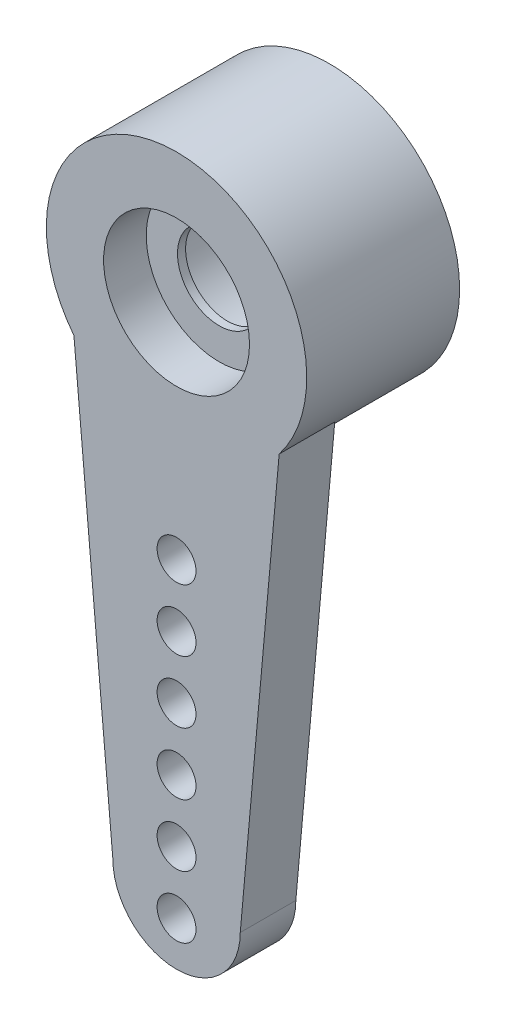
ISO-10303-21;
HEADER;
FILE_DESCRIPTION(('STEP AP214'),'2;1');
FILE_NAME('part.step','',(''),(''),'','','');
FILE_SCHEMA(('AUTOMOTIVE_DESIGN { 1 0 10303 214 1 1 1 1 }'));
ENDSEC;
DATA;
#1=APPLICATION_CONTEXT('core data for automotive mechanical design processes');
#2=APPLICATION_PROTOCOL_DEFINITION('international standard','automotive_design',2000,#1);
#3=PRODUCT_CONTEXT('',#1,'mechanical');
#4=PRODUCT('Part','Part','',(#3));
#5=PRODUCT_RELATED_PRODUCT_CATEGORY('part','',(#4));
#6=PRODUCT_DEFINITION_FORMATION('','',#4);
#7=PRODUCT_DEFINITION_CONTEXT('part definition',#1,'design');
#8=PRODUCT_DEFINITION('design','',#6,#7);
#9=PRODUCT_DEFINITION_SHAPE('','',#8);
#10=(LENGTH_UNIT() NAMED_UNIT(*) SI_UNIT(.MILLI.,.METRE.));
#11=(NAMED_UNIT(*) PLANE_ANGLE_UNIT() SI_UNIT($,.RADIAN.));
#12=(NAMED_UNIT(*) SI_UNIT($,.STERADIAN.) SOLID_ANGLE_UNIT());
#13=UNCERTAINTY_MEASURE_WITH_UNIT(LENGTH_MEASURE(1.E-05),#10,'distance_accuracy_value','');
#14=(GEOMETRIC_REPRESENTATION_CONTEXT(3) GLOBAL_UNCERTAINTY_ASSIGNED_CONTEXT((#13)) GLOBAL_UNIT_ASSIGNED_CONTEXT((#10,
#11,#12)) REPRESENTATION_CONTEXT('',''));
#15=CARTESIAN_POINT('',(0.,0.,0.));
#16=DIRECTION('',(0.,0.,1.));
#17=DIRECTION('',(1.,0.,0.));
#18=AXIS2_PLACEMENT_3D('',#15,#16,#17);
#19=CARTESIAN_POINT('',(-5.49999999999996,-3.00334196949804,-4.25710419796251));
#20=DIRECTION('',(0.,0.,-1.));
#21=DIRECTION('',(-1.,0.,0.));
#22=AXIS2_PLACEMENT_3D('',#19,#20,#21);
#23=CYLINDRICAL_SURFACE('',#22,0.2);
#24=CARTESIAN_POINT('',(-5.49999999999996,-3.00334196949804,-4.67620419796251));
#25=DIRECTION('',(0.,0.,1.));
#26=DIRECTION('',(1.,0.,0.));
#27=AXIS2_PLACEMENT_3D('',#24,#25,#26);
#28=CIRCLE('',#27,0.2);
#29=CARTESIAN_POINT('',(-5.29999999999996,-3.00334196949804,-4.67620419796251));
#30=VERTEX_POINT('',#29);
#31=EDGE_CURVE('E125',#30,#30,#28,.T.);
#32=ORIENTED_EDGE('',*,*,#31,.F.);
#33=EDGE_LOOP('',(#32));
#34=FACE_BOUND('',#33,.T.);
#35=CARTESIAN_POINT('',(-5.49999999999996,-3.00334196949804,-4.39620419796251));
#36=DIRECTION('',(0.,0.,1.));
#37=DIRECTION('',(1.,0.,0.));
#38=AXIS2_PLACEMENT_3D('',#35,#36,#37);
#39=CIRCLE('',#38,0.200000000000001);
#40=CARTESIAN_POINT('',(-5.29999999999996,-3.00334196949804,-4.39620419796251));
#41=VERTEX_POINT('',#40);
#42=EDGE_CURVE('E120',#41,#41,#39,.T.);
#43=ORIENTED_EDGE('',*,*,#42,.T.);
#44=EDGE_LOOP('',(#43));
#45=FACE_BOUND('',#44,.T.);
#46=ADVANCED_FACE('F40',(#34,#45),#23,.F.);
#47=CARTESIAN_POINT('',(-5.49999999999996,-3.00334196949804,-4.25710419796251));
#48=DIRECTION('',(0.,0.,1.));
#49=DIRECTION('',(1.,0.,0.));
#50=AXIS2_PLACEMENT_3D('',#47,#48,#49);
#51=PLANE('',#50);
#52=CARTESIAN_POINT('',(-5.49999999999996,-3.00334196949804,-4.25710419796251));
#53=DIRECTION('',(0.,0.,1.));
#54=DIRECTION('',(1.,0.,0.));
#55=AXIS2_PLACEMENT_3D('',#52,#53,#54);
#56=CIRCLE('',#55,0.35687);
#57=CARTESIAN_POINT('',(-5.21869499999996,-3.22294090819083,-4.25710419796251));
#58=VERTEX_POINT('',#57);
#59=CARTESIAN_POINT('',(-5.78130499999996,-3.22294090819083,-4.25710419796251));
#60=VERTEX_POINT('',#59);
#61=EDGE_CURVE('E49',#58,#60,#56,.T.);
#62=ORIENTED_EDGE('',*,*,#61,.T.);
#63=DIRECTION('',(0.0893287482023586,-0.996002196154506,0.));
#64=VECTOR('',#63,1.);
#65=CARTESIAN_POINT('',(-5.67462499999996,-4.41240696949804,-4.25710419796251));
#66=LINE('',#65,#64);
#67=CARTESIAN_POINT('',(-5.67462499999996,-4.41240696949804,-4.25710419796251));
#68=VERTEX_POINT('',#67);
#69=EDGE_CURVE('E218',#60,#68,#66,.T.);
#70=ORIENTED_EDGE('',*,*,#69,.T.);
#71=CARTESIAN_POINT('',(-5.49999999999996,-4.41240696949804,-4.25710419796251));
#72=DIRECTION('',(0.,0.,1.));
#73=DIRECTION('',(1.,0.,0.));
#74=AXIS2_PLACEMENT_3D('',#71,#72,#73);
#75=CIRCLE('',#74,0.174625);
#76=CARTESIAN_POINT('',(-5.32537499999996,-4.41240696949804,-4.25710419796251));
#77=VERTEX_POINT('',#76);
#78=EDGE_CURVE('E211',#68,#77,#75,.T.);
#79=ORIENTED_EDGE('',*,*,#78,.T.);
#80=DIRECTION('',(0.0893287482023584,0.996002196154506,0.));
#81=VECTOR('',#80,1.);
#82=CARTESIAN_POINT('',(-5.32537499999996,-4.41240696949804,-4.25710419796251));
#83=LINE('',#82,#81);
#84=EDGE_CURVE('E56',#77,#58,#83,.T.);
#85=ORIENTED_EDGE('',*,*,#84,.T.);
#86=EDGE_LOOP('',(#62,#70,#79,#85));
#87=FACE_BOUND('',#86,.T.);
#88=CARTESIAN_POINT('',(-5.49999999999996,-3.00334196949804,-4.25710419796251));
#89=DIRECTION('',(0.,0.,1.));
#90=DIRECTION('',(1.,0.,0.));
#91=AXIS2_PLACEMENT_3D('',#88,#89,#90);
#92=CIRCLE('',#91,0.2);
#93=CARTESIAN_POINT('',(-5.29999999999996,-3.00334196949804,-4.25710419796251));
#94=VERTEX_POINT('',#93);
#95=EDGE_CURVE('E129',#94,#94,#92,.T.);
#96=ORIENTED_EDGE('',*,*,#95,.F.);
#97=EDGE_LOOP('',(#96));
#98=FACE_BOUND('',#97,.T.);
#99=CARTESIAN_POINT('',(-5.49999999999996,-3.61484696949804,-4.25710419796251));
#100=DIRECTION('',(0.,0.,1.));
#101=DIRECTION('',(1.,0.,0.));
#102=AXIS2_PLACEMENT_3D('',#99,#100,#101);
#103=CIRCLE('',#102,0.0533399999999999);
#104=CARTESIAN_POINT('',(-5.44665999999996,-3.61484696949804,-4.25710419796251));
#105=VERTEX_POINT('',#104);
#106=EDGE_CURVE('E183',#105,#105,#103,.T.);
#107=ORIENTED_EDGE('',*,*,#106,.F.);
#108=EDGE_LOOP('',(#107));
#109=FACE_BOUND('',#108,.T.);
#110=CARTESIAN_POINT('',(-5.49999999999996,-3.78502696949804,-4.25710419796251));
#111=DIRECTION('',(0.,0.,1.));
#112=DIRECTION('',(1.,0.,0.));
#113=AXIS2_PLACEMENT_3D('',#110,#111,#112);
#114=CIRCLE('',#113,0.0533399999999999);
#115=CARTESIAN_POINT('',(-5.44665999999996,-3.78502696949804,-4.25710419796251));
#116=VERTEX_POINT('',#115);
#117=EDGE_CURVE('E187',#116,#116,#114,.T.);
#118=ORIENTED_EDGE('',*,*,#117,.F.);
#119=EDGE_LOOP('',(#118));
#120=FACE_BOUND('',#119,.T.);
#121=CARTESIAN_POINT('',(-5.49999999999996,-3.95520696949804,-4.25710419796251));
#122=DIRECTION('',(0.,0.,1.));
#123=DIRECTION('',(1.,0.,0.));
#124=AXIS2_PLACEMENT_3D('',#121,#122,#123);
#125=CIRCLE('',#124,0.05334);
#126=CARTESIAN_POINT('',(-5.44665999999996,-3.95520696949804,-4.25710419796251));
#127=VERTEX_POINT('',#126);
#128=EDGE_CURVE('E191',#127,#127,#125,.T.);
#129=ORIENTED_EDGE('',*,*,#128,.F.);
#130=EDGE_LOOP('',(#129));
#131=FACE_BOUND('',#130,.T.);
#132=CARTESIAN_POINT('',(-5.49999999999996,-4.12538696949804,-4.25710419796251));
#133=DIRECTION('',(0.,0.,1.));
#134=DIRECTION('',(1.,0.,0.));
#135=AXIS2_PLACEMENT_3D('',#132,#133,#134);
#136=CIRCLE('',#135,0.05334);
#137=CARTESIAN_POINT('',(-5.44665999999996,-4.12538696949804,-4.25710419796251));
#138=VERTEX_POINT('',#137);
#139=EDGE_CURVE('E195',#138,#138,#136,.T.);
#140=ORIENTED_EDGE('',*,*,#139,.F.);
#141=EDGE_LOOP('',(#140));
#142=FACE_BOUND('',#141,.T.);
#143=CARTESIAN_POINT('',(-5.49999999999996,-4.29556696949804,-4.25710419796251));
#144=DIRECTION('',(0.,0.,1.));
#145=DIRECTION('',(1.,0.,0.));
#146=AXIS2_PLACEMENT_3D('',#143,#144,#145);
#147=CIRCLE('',#146,0.05334);
#148=CARTESIAN_POINT('',(-5.44665999999996,-4.29556696949804,-4.25710419796251));
#149=VERTEX_POINT('',#148);
#150=EDGE_CURVE('E199',#149,#149,#147,.T.);
#151=ORIENTED_EDGE('',*,*,#150,.F.);
#152=EDGE_LOOP('',(#151));
#153=FACE_BOUND('',#152,.T.);
#154=CARTESIAN_POINT('',(-5.49999999999996,-4.46574696949804,-4.25710419796251));
#155=DIRECTION('',(0.,0.,1.));
#156=DIRECTION('',(1.,0.,0.));
#157=AXIS2_PLACEMENT_3D('',#154,#155,#156);
#158=CIRCLE('',#157,0.05334);
#159=CARTESIAN_POINT('',(-5.44665999999996,-4.46574696949804,-4.25710419796251));
#160=VERTEX_POINT('',#159);
#161=EDGE_CURVE('E202',#160,#160,#158,.T.);
#162=ORIENTED_EDGE('',*,*,#161,.F.);
#163=EDGE_LOOP('',(#162));
#164=FACE_BOUND('',#163,.T.);
#165=ADVANCED_FACE('F145',(#87,#98,#109,#120,#131,#142,#153,#164),#51,.T.);
#166=CARTESIAN_POINT('',(-5.49999999999996,-3.00334196949804,-4.67620419796251));
#167=DIRECTION('',(0.,0.,1.));
#168=DIRECTION('',(1.,0.,0.));
#169=AXIS2_PLACEMENT_3D('',#166,#167,#168);
#170=PLANE('',#169);
#171=CARTESIAN_POINT('',(-5.49999999999996,-3.00334196949804,-4.67620419796251));
#172=DIRECTION('',(0.,0.,1.));
#173=DIRECTION('',(1.,0.,0.));
#174=AXIS2_PLACEMENT_3D('',#171,#172,#173);
#175=CIRCLE('',#174,0.35687);
#176=CARTESIAN_POINT('',(-5.14312999999996,-3.00334196949804,-4.67620419796251));
#177=VERTEX_POINT('',#176);
#178=EDGE_CURVE('E133',#177,#177,#175,.T.);
#179=ORIENTED_EDGE('',*,*,#178,.F.);
#180=EDGE_LOOP('',(#179));
#181=FACE_BOUND('',#180,.T.);
#182=ORIENTED_EDGE('',*,*,#31,.T.);
#183=EDGE_LOOP('',(#182));
#184=FACE_BOUND('',#183,.T.);
#185=ADVANCED_FACE('F142',(#181,#184),#170,.F.);
#186=CARTESIAN_POINT('',(-5.49999999999996,-3.00334196949804,-4.25710419796251));
#187=DIRECTION('',(0.,0.,-1.));
#188=DIRECTION('',(-1.,0.,0.));
#189=AXIS2_PLACEMENT_3D('',#186,#187,#188);
#190=CYLINDRICAL_SURFACE('',#189,0.35687);
#191=CARTESIAN_POINT('',(-5.49999999999996,-3.00334196949804,-4.40950419796251));
#192=DIRECTION('',(0.,0.,-1.));
#193=DIRECTION('',(-1.,0.,0.));
#194=AXIS2_PLACEMENT_3D('',#191,#192,#193);
#195=CIRCLE('',#194,0.35687);
#196=CARTESIAN_POINT('',(-5.21869499999996,-3.22294090819083,-4.40950419796251));
#197=VERTEX_POINT('',#196);
#198=CARTESIAN_POINT('',(-5.78130499999996,-3.22294090819083,-4.40950419796251));
#199=VERTEX_POINT('',#198);
#200=EDGE_CURVE('E91',#197,#199,#195,.T.);
#201=ORIENTED_EDGE('',*,*,#200,.T.);
#202=DIRECTION('',(0.,0.,1.));
#203=VECTOR('',#202,1.);
#204=CARTESIAN_POINT('',(-5.78130499999996,-3.22294090819083,-4.40950419796251));
#205=LINE('',#204,#203);
#206=EDGE_CURVE('E108',#199,#60,#205,.T.);
#207=ORIENTED_EDGE('',*,*,#206,.T.);
#208=ORIENTED_EDGE('',*,*,#61,.F.);
#209=DIRECTION('',(0.,0.,1.));
#210=VECTOR('',#209,1.);
#211=CARTESIAN_POINT('',(-5.21869499999996,-3.22294090819083,-4.40950419796251));
#212=LINE('',#211,#210);
#213=EDGE_CURVE('E101',#197,#58,#212,.T.);
#214=ORIENTED_EDGE('',*,*,#213,.F.);
#215=EDGE_LOOP('',(#201,#207,#208,#214));
#216=FACE_BOUND('',#215,.T.);
#217=ORIENTED_EDGE('',*,*,#178,.T.);
#218=EDGE_LOOP('',(#217));
#219=FACE_BOUND('',#218,.T.);
#220=ADVANCED_FACE('F42',(#216,#219),#190,.T.);
#221=CARTESIAN_POINT('',(-5.49999999999996,-3.00334196949804,-4.37394419796251));
#222=DIRECTION('',(0.,0.,1.));
#223=DIRECTION('',(1.,0.,0.));
#224=AXIS2_PLACEMENT_3D('',#221,#222,#223);
#225=CIRCLE('',#224,0.2);
#226=CARTESIAN_POINT('',(-5.29999999999996,-3.00334196949804,-4.37394419796251));
#227=VERTEX_POINT('',#226);
#228=EDGE_CURVE('E12',#227,#227,#225,.T.);
#229=ORIENTED_EDGE('',*,*,#228,.F.);
#230=EDGE_LOOP('',(#229));
#231=FACE_BOUND('',#230,.T.);
#232=ORIENTED_EDGE('',*,*,#95,.T.);
#233=EDGE_LOOP('',(#232));
#234=FACE_BOUND('',#233,.T.);
#235=ADVANCED_FACE('F151',(#231,#234),#23,.F.);
#236=CARTESIAN_POINT('',(-5.49999999999996,-3.00334196949804,-4.39620419796251));
#237=DIRECTION('',(0.,0.,1.));
#238=DIRECTION('',(1.,0.,0.));
#239=AXIS2_PLACEMENT_3D('',#236,#237,#238);
#240=PLANE('',#239);
#241=ORIENTED_EDGE('',*,*,#42,.F.);
#242=EDGE_LOOP('',(#241));
#243=FACE_BOUND('',#242,.T.);
#244=CARTESIAN_POINT('',(-5.49999999999996,-3.00334196949804,-4.39620419796251));
#245=DIRECTION('',(0.,0.,1.));
#246=DIRECTION('',(1.,0.,0.));
#247=AXIS2_PLACEMENT_3D('',#244,#245,#246);
#248=CIRCLE('',#247,0.114300000000001);
#249=CARTESIAN_POINT('',(-5.38569999999996,-3.00334196949804,-4.39620419796251));
#250=VERTEX_POINT('',#249);
#251=EDGE_CURVE('E116',#250,#250,#248,.T.);
#252=ORIENTED_EDGE('',*,*,#251,.T.);
#253=EDGE_LOOP('',(#252));
#254=FACE_BOUND('',#253,.T.);
#255=ADVANCED_FACE('F154',(#243,#254),#240,.F.);
#256=CARTESIAN_POINT('',(-5.49999999999996,-3.00334196949804,-3.69141877301327));
#257=DIRECTION('',(0.,0.,-1.));
#258=DIRECTION('',(-1.,0.,0.));
#259=AXIS2_PLACEMENT_3D('',#256,#257,#258);
#260=CYLINDRICAL_SURFACE('',#259,0.114300000000001);
#261=ORIENTED_EDGE('',*,*,#251,.F.);
#262=EDGE_LOOP('',(#261));
#263=FACE_BOUND('',#262,.T.);
#264=CARTESIAN_POINT('',(-5.49999999999996,-3.00334196949804,-4.37394419796251));
#265=DIRECTION('',(0.,0.,1.));
#266=DIRECTION('',(1.,0.,0.));
#267=AXIS2_PLACEMENT_3D('',#264,#265,#266);
#268=CIRCLE('',#267,0.114300000000001);
#269=CARTESIAN_POINT('',(-5.38569999999996,-3.00334196949804,-4.37394419796251));
#270=VERTEX_POINT('',#269);
#271=EDGE_CURVE('E121',#270,#270,#268,.T.);
#272=ORIENTED_EDGE('',*,*,#271,.T.);
#273=EDGE_LOOP('',(#272));
#274=FACE_BOUND('',#273,.T.);
#275=ADVANCED_FACE('F157',(#263,#274),#260,.F.);
#276=CARTESIAN_POINT('',(-5.49999999999996,-3.00334196949804,-4.37394419796251));
#277=DIRECTION('',(0.,0.,1.));
#278=DIRECTION('',(1.,0.,0.));
#279=AXIS2_PLACEMENT_3D('',#276,#277,#278);
#280=PLANE('',#279);
#281=ORIENTED_EDGE('',*,*,#271,.F.);
#282=EDGE_LOOP('',(#281));
#283=FACE_BOUND('',#282,.T.);
#284=ORIENTED_EDGE('',*,*,#228,.T.);
#285=EDGE_LOOP('',(#284));
#286=FACE_BOUND('',#285,.T.);
#287=ADVANCED_FACE('F163',(#283,#286),#280,.T.);
#288=CARTESIAN_POINT('',(-5.49999999999996,-4.41240696949804,-4.40950419796251));
#289=DIRECTION('',(0.,0.,1.));
#290=DIRECTION('',(1.,0.,0.));
#291=AXIS2_PLACEMENT_3D('',#288,#289,#290);
#292=CYLINDRICAL_SURFACE('',#291,0.174625);
#293=ORIENTED_EDGE('',*,*,#78,.F.);
#294=DIRECTION('',(0.,0.,1.));
#295=VECTOR('',#294,1.);
#296=CARTESIAN_POINT('',(-5.67462499999996,-4.41240696949804,-4.40950419796251));
#297=LINE('',#296,#295);
#298=CARTESIAN_POINT('',(-5.67462499999996,-4.41240696949804,-4.40950419796251));
#299=VERTEX_POINT('',#298);
#300=EDGE_CURVE('E65',#299,#68,#297,.T.);
#301=ORIENTED_EDGE('',*,*,#300,.F.);
#302=CARTESIAN_POINT('',(-5.49999999999996,-4.41240696949804,-4.40950419796251));
#303=DIRECTION('',(0.,0.,1.));
#304=DIRECTION('',(1.,0.,0.));
#305=AXIS2_PLACEMENT_3D('',#302,#303,#304);
#306=CIRCLE('',#305,0.174625);
#307=CARTESIAN_POINT('',(-5.32537499999996,-4.41240696949804,-4.40950419796251));
#308=VERTEX_POINT('',#307);
#309=EDGE_CURVE('E104',#299,#308,#306,.T.);
#310=ORIENTED_EDGE('',*,*,#309,.T.);
#311=DIRECTION('',(0.,0.,1.));
#312=VECTOR('',#311,1.);
#313=CARTESIAN_POINT('',(-5.32537499999996,-4.41240696949804,-4.40950419796251));
#314=LINE('',#313,#312);
#315=EDGE_CURVE('E85',#308,#77,#314,.T.);
#316=ORIENTED_EDGE('',*,*,#315,.T.);
#317=EDGE_LOOP('',(#293,#301,#310,#316));
#318=FACE_BOUND('',#317,.T.);
#319=ADVANCED_FACE('F169',(#318),#292,.T.);
#320=CARTESIAN_POINT('',(-5.67462499999996,-4.41240696949804,-4.40950419796251));
#321=DIRECTION('',(-0.996002196154506,-0.0893287482023586,0.));
#322=DIRECTION('',(0.0893287482023586,-0.996002196154506,0.));
#323=AXIS2_PLACEMENT_3D('',#320,#321,#322);
#324=PLANE('',#323);
#325=ORIENTED_EDGE('',*,*,#69,.F.);
#326=ORIENTED_EDGE('',*,*,#206,.F.);
#327=DIRECTION('',(0.0893287482023586,-0.996002196154506,0.));
#328=VECTOR('',#327,1.);
#329=CARTESIAN_POINT('',(-5.67462499999996,-4.41240696949804,-4.40950419796251));
#330=LINE('',#329,#328);
#331=EDGE_CURVE('E94',#199,#299,#330,.T.);
#332=ORIENTED_EDGE('',*,*,#331,.T.);
#333=ORIENTED_EDGE('',*,*,#300,.T.);
#334=EDGE_LOOP('',(#325,#326,#332,#333));
#335=FACE_BOUND('',#334,.T.);
#336=ADVANCED_FACE('F229',(#335),#324,.T.);
#337=CARTESIAN_POINT('',(-5.32537499999996,-4.41240696949804,-4.40950419796251));
#338=DIRECTION('',(0.996002196154506,-0.0893287482023584,0.));
#339=DIRECTION('',(0.0893287482023584,0.996002196154506,0.));
#340=AXIS2_PLACEMENT_3D('',#337,#338,#339);
#341=PLANE('',#340);
#342=ORIENTED_EDGE('',*,*,#84,.F.);
#343=ORIENTED_EDGE('',*,*,#315,.F.);
#344=DIRECTION('',(0.0893287482023584,0.996002196154506,0.));
#345=VECTOR('',#344,1.);
#346=CARTESIAN_POINT('',(-5.32537499999996,-4.41240696949804,-4.40950419796251));
#347=LINE('',#346,#345);
#348=EDGE_CURVE('E93',#308,#197,#347,.T.);
#349=ORIENTED_EDGE('',*,*,#348,.T.);
#350=ORIENTED_EDGE('',*,*,#213,.T.);
#351=EDGE_LOOP('',(#342,#343,#349,#350));
#352=FACE_BOUND('',#351,.T.);
#353=ADVANCED_FACE('F100',(#352),#341,.T.);
#354=CARTESIAN_POINT('',(-5.49999999999996,-4.41240696949804,-4.40950419796251));
#355=DIRECTION('',(0.,0.,1.));
#356=DIRECTION('',(1.,0.,0.));
#357=AXIS2_PLACEMENT_3D('',#354,#355,#356);
#358=PLANE('',#357);
#359=CARTESIAN_POINT('',(-5.49999999999996,-3.61484696949804,-4.40950419796251));
#360=DIRECTION('',(0.,0.,1.));
#361=DIRECTION('',(1.,0.,0.));
#362=AXIS2_PLACEMENT_3D('',#359,#360,#361);
#363=CIRCLE('',#362,0.0533399999999999);
#364=CARTESIAN_POINT('',(-5.44665999999996,-3.61484696949804,-4.40950419796251));
#365=VERTEX_POINT('',#364);
#366=EDGE_CURVE('E270',#365,#365,#363,.T.);
#367=ORIENTED_EDGE('',*,*,#366,.T.);
#368=EDGE_LOOP('',(#367));
#369=FACE_BOUND('',#368,.T.);
#370=CARTESIAN_POINT('',(-5.49999999999996,-3.78502696949804,-4.40950419796251));
#371=DIRECTION('',(0.,0.,1.));
#372=DIRECTION('',(1.,0.,0.));
#373=AXIS2_PLACEMENT_3D('',#370,#371,#372);
#374=CIRCLE('',#373,0.0533399999999999);
#375=CARTESIAN_POINT('',(-5.44665999999996,-3.78502696949804,-4.40950419796251));
#376=VERTEX_POINT('',#375);
#377=EDGE_CURVE('E276',#376,#376,#374,.T.);
#378=ORIENTED_EDGE('',*,*,#377,.T.);
#379=EDGE_LOOP('',(#378));
#380=FACE_BOUND('',#379,.T.);
#381=CARTESIAN_POINT('',(-5.49999999999996,-3.95520696949804,-4.40950419796251));
#382=DIRECTION('',(0.,0.,1.));
#383=DIRECTION('',(1.,0.,0.));
#384=AXIS2_PLACEMENT_3D('',#381,#382,#383);
#385=CIRCLE('',#384,0.05334);
#386=CARTESIAN_POINT('',(-5.44665999999996,-3.95520696949804,-4.40950419796251));
#387=VERTEX_POINT('',#386);
#388=EDGE_CURVE('E282',#387,#387,#385,.T.);
#389=ORIENTED_EDGE('',*,*,#388,.T.);
#390=EDGE_LOOP('',(#389));
#391=FACE_BOUND('',#390,.T.);
#392=CARTESIAN_POINT('',(-5.49999999999996,-4.12538696949804,-4.40950419796251));
#393=DIRECTION('',(0.,0.,1.));
#394=DIRECTION('',(1.,0.,0.));
#395=AXIS2_PLACEMENT_3D('',#392,#393,#394);
#396=CIRCLE('',#395,0.05334);
#397=CARTESIAN_POINT('',(-5.44665999999996,-4.12538696949804,-4.40950419796251));
#398=VERTEX_POINT('',#397);
#399=EDGE_CURVE('E288',#398,#398,#396,.T.);
#400=ORIENTED_EDGE('',*,*,#399,.T.);
#401=EDGE_LOOP('',(#400));
#402=FACE_BOUND('',#401,.T.);
#403=CARTESIAN_POINT('',(-5.49999999999996,-4.29556696949804,-4.40950419796251));
#404=DIRECTION('',(0.,0.,1.));
#405=DIRECTION('',(1.,0.,0.));
#406=AXIS2_PLACEMENT_3D('',#403,#404,#405);
#407=CIRCLE('',#406,0.05334);
#408=CARTESIAN_POINT('',(-5.44665999999996,-4.29556696949804,-4.40950419796251));
#409=VERTEX_POINT('',#408);
#410=EDGE_CURVE('E206',#409,#409,#407,.T.);
#411=ORIENTED_EDGE('',*,*,#410,.T.);
#412=EDGE_LOOP('',(#411));
#413=FACE_BOUND('',#412,.T.);
#414=CARTESIAN_POINT('',(-5.49999999999996,-4.46574696949804,-4.40950419796251));
#415=DIRECTION('',(0.,0.,1.));
#416=DIRECTION('',(1.,0.,0.));
#417=AXIS2_PLACEMENT_3D('',#414,#415,#416);
#418=CIRCLE('',#417,0.05334);
#419=CARTESIAN_POINT('',(-5.44665999999996,-4.46574696949804,-4.40950419796251));
#420=VERTEX_POINT('',#419);
#421=EDGE_CURVE('E205',#420,#420,#418,.T.);
#422=ORIENTED_EDGE('',*,*,#421,.T.);
#423=EDGE_LOOP('',(#422));
#424=FACE_BOUND('',#423,.T.);
#425=ORIENTED_EDGE('',*,*,#309,.F.);
#426=ORIENTED_EDGE('',*,*,#331,.F.);
#427=ORIENTED_EDGE('',*,*,#200,.F.);
#428=ORIENTED_EDGE('',*,*,#348,.F.);
#429=EDGE_LOOP('',(#425,#426,#427,#428));
#430=FACE_BOUND('',#429,.T.);
#431=ADVANCED_FACE('F92',(#369,#380,#391,#402,#413,#424,#430),#358,.F.);
#432=CARTESIAN_POINT('',(-5.49999999999996,-4.46574696949804,-4.40950419796251));
#433=DIRECTION('',(0.,0.,1.));
#434=DIRECTION('',(1.,0.,0.));
#435=AXIS2_PLACEMENT_3D('',#432,#433,#434);
#436=CYLINDRICAL_SURFACE('',#435,0.05334);
#437=ORIENTED_EDGE('',*,*,#421,.F.);
#438=EDGE_LOOP('',(#437));
#439=FACE_BOUND('',#438,.T.);
#440=ORIENTED_EDGE('',*,*,#161,.T.);
#441=EDGE_LOOP('',(#440));
#442=FACE_BOUND('',#441,.T.);
#443=ADVANCED_FACE('F241',(#439,#442),#436,.F.);
#444=CARTESIAN_POINT('',(-5.49999999999996,-4.29556696949804,-4.40950419796251));
#445=DIRECTION('',(0.,0.,1.));
#446=DIRECTION('',(1.,0.,0.));
#447=AXIS2_PLACEMENT_3D('',#444,#445,#446);
#448=CYLINDRICAL_SURFACE('',#447,0.05334);
#449=ORIENTED_EDGE('',*,*,#410,.F.);
#450=EDGE_LOOP('',(#449));
#451=FACE_BOUND('',#450,.T.);
#452=ORIENTED_EDGE('',*,*,#150,.T.);
#453=EDGE_LOOP('',(#452));
#454=FACE_BOUND('',#453,.T.);
#455=ADVANCED_FACE('F245',(#451,#454),#448,.F.);
#456=CARTESIAN_POINT('',(-5.49999999999996,-4.12538696949804,-4.40950419796251));
#457=DIRECTION('',(0.,0.,1.));
#458=DIRECTION('',(1.,0.,0.));
#459=AXIS2_PLACEMENT_3D('',#456,#457,#458);
#460=CYLINDRICAL_SURFACE('',#459,0.05334);
#461=ORIENTED_EDGE('',*,*,#399,.F.);
#462=EDGE_LOOP('',(#461));
#463=FACE_BOUND('',#462,.T.);
#464=ORIENTED_EDGE('',*,*,#139,.T.);
#465=EDGE_LOOP('',(#464));
#466=FACE_BOUND('',#465,.T.);
#467=ADVANCED_FACE('F249',(#463,#466),#460,.F.);
#468=CARTESIAN_POINT('',(-5.49999999999996,-3.95520696949804,-4.40950419796251));
#469=DIRECTION('',(0.,0.,1.));
#470=DIRECTION('',(1.,0.,0.));
#471=AXIS2_PLACEMENT_3D('',#468,#469,#470);
#472=CYLINDRICAL_SURFACE('',#471,0.05334);
#473=ORIENTED_EDGE('',*,*,#388,.F.);
#474=EDGE_LOOP('',(#473));
#475=FACE_BOUND('',#474,.T.);
#476=ORIENTED_EDGE('',*,*,#128,.T.);
#477=EDGE_LOOP('',(#476));
#478=FACE_BOUND('',#477,.T.);
#479=ADVANCED_FACE('F253',(#475,#478),#472,.F.);
#480=CARTESIAN_POINT('',(-5.49999999999996,-3.78502696949804,-4.40950419796251));
#481=DIRECTION('',(0.,0.,1.));
#482=DIRECTION('',(1.,0.,0.));
#483=AXIS2_PLACEMENT_3D('',#480,#481,#482);
#484=CYLINDRICAL_SURFACE('',#483,0.0533399999999999);
#485=ORIENTED_EDGE('',*,*,#377,.F.);
#486=EDGE_LOOP('',(#485));
#487=FACE_BOUND('',#486,.T.);
#488=ORIENTED_EDGE('',*,*,#117,.T.);
#489=EDGE_LOOP('',(#488));
#490=FACE_BOUND('',#489,.T.);
#491=ADVANCED_FACE('F257',(#487,#490),#484,.F.);
#492=CARTESIAN_POINT('',(-5.49999999999996,-3.61484696949804,-4.40950419796251));
#493=DIRECTION('',(0.,0.,1.));
#494=DIRECTION('',(1.,0.,0.));
#495=AXIS2_PLACEMENT_3D('',#492,#493,#494);
#496=CYLINDRICAL_SURFACE('',#495,0.0533399999999999);
#497=ORIENTED_EDGE('',*,*,#366,.F.);
#498=EDGE_LOOP('',(#497));
#499=FACE_BOUND('',#498,.T.);
#500=ORIENTED_EDGE('',*,*,#106,.T.);
#501=EDGE_LOOP('',(#500));
#502=FACE_BOUND('',#501,.T.);
#503=ADVANCED_FACE('F261',(#499,#502),#496,.F.);
#504=CLOSED_SHELL('',(#46,#165,#185,#220,#235,#255,#275,#287,#319,#336,#353,#431,#443,#455,#467,
#479,#491,#503));
#505=MANIFOLD_SOLID_BREP('B2',#504);
#506=ADVANCED_BREP_SHAPE_REPRESENTATION('',(#18,#505),#14);
#507=SHAPE_DEFINITION_REPRESENTATION(#9,#506);
ENDSEC;
END-ISO-10303-21;
